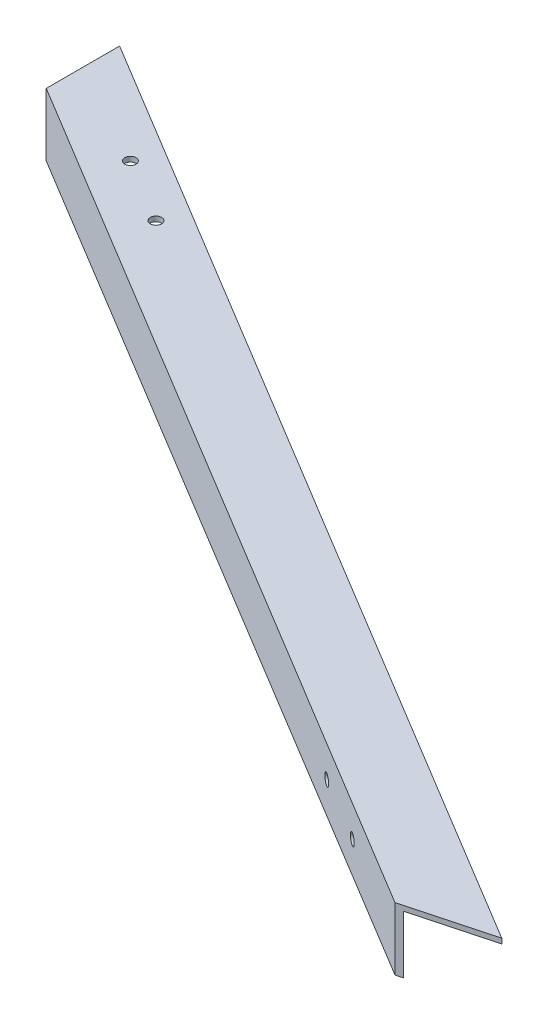
ISO-10303-21;
HEADER;
FILE_DESCRIPTION(('STEP AP214'),'2;1');
FILE_NAME('part.step','',(''),(''),'','','');
FILE_SCHEMA(('AUTOMOTIVE_DESIGN { 1 0 10303 214 1 1 1 1 }'));
ENDSEC;
DATA;
#1=APPLICATION_CONTEXT('core data for automotive mechanical design processes');
#2=APPLICATION_PROTOCOL_DEFINITION('international standard','automotive_design',2000,#1);
#3=PRODUCT_CONTEXT('',#1,'mechanical');
#4=PRODUCT('Part','Part','',(#3));
#5=PRODUCT_RELATED_PRODUCT_CATEGORY('part','',(#4));
#6=PRODUCT_DEFINITION_FORMATION('','',#4);
#7=PRODUCT_DEFINITION_CONTEXT('part definition',#1,'design');
#8=PRODUCT_DEFINITION('design','',#6,#7);
#9=PRODUCT_DEFINITION_SHAPE('','',#8);
#10=(LENGTH_UNIT() NAMED_UNIT(*) SI_UNIT(.MILLI.,.METRE.));
#11=(NAMED_UNIT(*) PLANE_ANGLE_UNIT() SI_UNIT($,.RADIAN.));
#12=(NAMED_UNIT(*) SI_UNIT($,.STERADIAN.) SOLID_ANGLE_UNIT());
#13=UNCERTAINTY_MEASURE_WITH_UNIT(LENGTH_MEASURE(1.E-05),#10,'distance_accuracy_value','');
#14=(GEOMETRIC_REPRESENTATION_CONTEXT(3) GLOBAL_UNCERTAINTY_ASSIGNED_CONTEXT((#13)) GLOBAL_UNIT_ASSIGNED_CONTEXT((#10,
#11,#12)) REPRESENTATION_CONTEXT('',''));
#15=CARTESIAN_POINT('',(0.,0.,0.));
#16=DIRECTION('',(0.,0.,1.));
#17=DIRECTION('',(1.,0.,0.));
#18=AXIS2_PLACEMENT_3D('',#15,#16,#17);
#19=CARTESIAN_POINT('',(-1366.522079355,1741.9,2606.955776238));
#20=DIRECTION('',(0.,-1.,0.));
#21=DIRECTION('',(0.965925826288944,0.,-0.258819045102985));
#22=AXIS2_PLACEMENT_3D('',#19,#20,#21);
#23=CYLINDRICAL_SURFACE('',#22,4.5);
#24=CARTESIAN_POINT('',(-1366.522079355,1742.,2606.955776238));
#25=DIRECTION('',(0.,-1.,0.));
#26=DIRECTION('',(0.965925826288944,0.,-0.258819045102985));
#27=AXIS2_PLACEMENT_3D('',#24,#25,#26);
#28=CIRCLE('',#27,4.5);
#29=CARTESIAN_POINT('',(-1362.175413136,1742.,2605.791090535));
#30=VERTEX_POINT('',#29);
#31=EDGE_CURVE('E141',#30,#30,#28,.T.);
#32=ORIENTED_EDGE('',*,*,#31,.T.);
#33=DIRECTION('',(0.,1.,0.));
#34=VECTOR('',#33,1.);
#35=CARTESIAN_POINT('',(-1362.175413136,1741.9,2605.791090535));
#36=LINE('',#35,#34);
#37=CARTESIAN_POINT('',(-1362.175413136,1746.,2605.791090535));
#38=VERTEX_POINT('',#37);
#39=EDGE_CURVE('E11',#30,#38,#36,.T.);
#40=ORIENTED_EDGE('',*,*,#39,.T.);
#41=CARTESIAN_POINT('',(-1366.522079355,1746.,2606.955776238));
#42=DIRECTION('',(0.,-1.,0.));
#43=DIRECTION('',(0.965925826288944,0.,-0.258819045102985));
#44=AXIS2_PLACEMENT_3D('',#41,#42,#43);
#45=CIRCLE('',#44,4.5);
#46=EDGE_CURVE('E161',#38,#38,#45,.T.);
#47=ORIENTED_EDGE('',*,*,#46,.F.);
#48=ORIENTED_EDGE('',*,*,#39,.F.);
#49=EDGE_LOOP('',(#32,#40,#47,#48));
#50=FACE_BOUND('',#49,.T.);
#51=ADVANCED_FACE('F17',(#50),#23,.F.);
#52=CARTESIAN_POINT('',(-1315.151526504,1741.9,2637.956845571));
#53=DIRECTION('',(0.,-1.,0.));
#54=DIRECTION('',(0.965925826288944,0.,-0.258819045102985));
#55=AXIS2_PLACEMENT_3D('',#52,#53,#54);
#56=CYLINDRICAL_SURFACE('',#55,4.5);
#57=CARTESIAN_POINT('',(-1315.151526504,1742.,2637.956845571));
#58=DIRECTION('',(0.,-1.,0.));
#59=DIRECTION('',(0.965925826288944,0.,-0.258819045102985));
#60=AXIS2_PLACEMENT_3D('',#57,#58,#59);
#61=CIRCLE('',#60,4.5);
#62=CARTESIAN_POINT('',(-1310.804860285,1742.,2636.792159868));
#63=VERTEX_POINT('',#62);
#64=EDGE_CURVE('E138',#63,#63,#61,.T.);
#65=ORIENTED_EDGE('',*,*,#64,.T.);
#66=DIRECTION('',(0.,1.,0.));
#67=VECTOR('',#66,1.);
#68=CARTESIAN_POINT('',(-1310.804860285,1741.9,2636.792159868));
#69=LINE('',#68,#67);
#70=CARTESIAN_POINT('',(-1310.804860285,1746.,2636.792159868));
#71=VERTEX_POINT('',#70);
#72=EDGE_CURVE('E26',#63,#71,#69,.T.);
#73=ORIENTED_EDGE('',*,*,#72,.T.);
#74=CARTESIAN_POINT('',(-1315.151526504,1746.,2637.956845571));
#75=DIRECTION('',(0.,-1.,0.));
#76=DIRECTION('',(0.965925826288944,0.,-0.258819045102985));
#77=AXIS2_PLACEMENT_3D('',#74,#75,#76);
#78=CIRCLE('',#77,4.5);
#79=EDGE_CURVE('E159',#71,#71,#78,.T.);
#80=ORIENTED_EDGE('',*,*,#79,.F.);
#81=ORIENTED_EDGE('',*,*,#72,.F.);
#82=EDGE_LOOP('',(#65,#73,#80,#81));
#83=FACE_BOUND('',#82,.T.);
#84=ADVANCED_FACE('F288',(#83),#56,.F.);
#85=CARTESIAN_POINT('',(-1557.75754959,1696.,2520.748721302));
#86=DIRECTION('',(0.516684488886123,0.,-0.856175880847204));
#87=DIRECTION('',(0.,-1.,0.));
#88=AXIS2_PLACEMENT_3D('',#85,#86,#87);
#89=PLANE('',#88);
#90=CARTESIAN_POINT('',(-884.9214029801,1721.,2926.791461225));
#91=DIRECTION('',(0.516684488886123,0.,-0.856175880847204));
#92=DIRECTION('',(0.856175880847204,0.,0.516684488886123));
#93=AXIS2_PLACEMENT_3D('',#90,#91,#92);
#94=CIRCLE('',#93,4.5);
#95=CARTESIAN_POINT('',(-881.0686115163,1721.,2929.116541425));
#96=VERTEX_POINT('',#95);
#97=EDGE_CURVE('E123',#96,#96,#94,.T.);
#98=ORIENTED_EDGE('',*,*,#97,.F.);
#99=EDGE_LOOP('',(#98));
#100=FACE_BOUND('',#99,.T.);
#101=CARTESIAN_POINT('',(-833.5508501292,1721.,2957.792530558));
#102=DIRECTION('',(0.516684488886123,0.,-0.856175880847204));
#103=DIRECTION('',(0.856175880847204,0.,0.516684488886123));
#104=AXIS2_PLACEMENT_3D('',#101,#102,#103);
#105=CIRCLE('',#104,4.5);
#106=CARTESIAN_POINT('',(-829.6980586654,1721.,2960.117610758));
#107=VERTEX_POINT('',#106);
#108=EDGE_CURVE('E119',#107,#107,#105,.T.);
#109=ORIENTED_EDGE('',*,*,#108,.F.);
#110=EDGE_LOOP('',(#109));
#111=FACE_BOUND('',#110,.T.);
#112=DIRECTION('',(0.,1.,0.));
#113=VECTOR('',#112,1.);
#114=CARTESIAN_POINT('',(-1450.,1708.5,2585.77818041));
#115=LINE('',#114,#113);
#116=CARTESIAN_POINT('',(-1450.,1696.,2585.77818041));
#117=VERTEX_POINT('',#116);
#118=CARTESIAN_POINT('',(-1450.,1742.,2585.77818041));
#119=VERTEX_POINT('',#118);
#120=EDGE_CURVE('E199',#117,#119,#115,.T.);
#121=ORIENTED_EDGE('',*,*,#120,.T.);
#122=DIRECTION('',(0.856175880847204,0.,0.516684488886123));
#123=VECTOR('',#122,1.);
#124=CARTESIAN_POINT('',(-1557.75754959,1742.,2520.748721302));
#125=LINE('',#124,#123);
#126=CARTESIAN_POINT('',(-744.6387605197,1742.,3011.449143181));
#127=VERTEX_POINT('',#126);
#128=EDGE_CURVE('E142',#119,#127,#125,.T.);
#129=ORIENTED_EDGE('',*,*,#128,.T.);
#130=DIRECTION('',(0.,-1.,0.));
#131=VECTOR('',#130,1.);
#132=CARTESIAN_POINT('',(-744.6387605197,848.,3011.449143181));
#133=LINE('',#132,#131);
#134=CARTESIAN_POINT('',(-744.6387605197,1696.,3011.449143181));
#135=VERTEX_POINT('',#134);
#136=EDGE_CURVE('E170',#127,#135,#133,.T.);
#137=ORIENTED_EDGE('',*,*,#136,.T.);
#138=DIRECTION('',(0.856175880847204,0.,0.516684488886123));
#139=VECTOR('',#138,1.);
#140=CARTESIAN_POINT('',(-1557.75754959,1696.,2520.748721302));
#141=LINE('',#140,#139);
#142=EDGE_CURVE('E166',#117,#135,#141,.T.);
#143=ORIENTED_EDGE('',*,*,#142,.F.);
#144=EDGE_LOOP('',(#121,#129,#137,#143));
#145=FACE_BOUND('',#144,.T.);
#146=ADVANCED_FACE('F266',(#100,#111,#145),#89,.T.);
#147=CARTESIAN_POINT('',(-1557.75754959,1742.,2520.748721302));
#148=DIRECTION('',(0.,-1.,0.));
#149=DIRECTION('',(0.,0.,-1.));
#150=AXIS2_PLACEMENT_3D('',#147,#148,#149);
#151=PLANE('',#150);
#152=ORIENTED_EDGE('',*,*,#31,.F.);
#153=EDGE_LOOP('',(#152));
#154=FACE_BOUND('',#153,.T.);
#155=ORIENTED_EDGE('',*,*,#64,.F.);
#156=EDGE_LOOP('',(#155));
#157=FACE_BOUND('',#156,.T.);
#158=DIRECTION('',(0.,0.,-1.));
#159=VECTOR('',#158,1.);
#160=CARTESIAN_POINT('',(-1450.,1742.,2555.599419487));
#161=LINE('',#160,#159);
#162=CARTESIAN_POINT('',(-1450.,1742.,2532.050901905));
#163=VERTEX_POINT('',#162);
#164=EDGE_CURVE('E194',#119,#163,#161,.T.);
#165=ORIENTED_EDGE('',*,*,#164,.T.);
#166=DIRECTION('',(0.856175880847204,0.,0.516684488886123));
#167=VECTOR('',#166,1.);
#168=CARTESIAN_POINT('',(-1533.990063101,1742.,2481.364630783));
#169=LINE('',#168,#167);
#170=CARTESIAN_POINT('',(-682.984506497,1742.,2994.928935606));
#171=VERTEX_POINT('',#170);
#172=EDGE_CURVE('E137',#163,#171,#169,.T.);
#173=ORIENTED_EDGE('',*,*,#172,.T.);
#174=DIRECTION('',(-0.965925826288944,0.,0.258819045102985));
#175=VECTOR('',#174,1.);
#176=CARTESIAN_POINT('',(-713.4712112364,1742.,3003.09782352));
#177=LINE('',#176,#175);
#178=EDGE_CURVE('E173',#171,#127,#177,.T.);
#179=ORIENTED_EDGE('',*,*,#178,.T.);
#180=ORIENTED_EDGE('',*,*,#128,.F.);
#181=EDGE_LOOP('',(#165,#173,#179,#180));
#182=FACE_BOUND('',#181,.T.);
#183=ADVANCED_FACE('F191',(#154,#157,#182),#151,.T.);
#184=CARTESIAN_POINT('',(-1533.990063101,1742.,2481.364630783));
#185=DIRECTION('',(0.516684488886123,0.,-0.856175880847204));
#186=DIRECTION('',(0.,-1.,0.));
#187=AXIS2_PLACEMENT_3D('',#184,#185,#186);
#188=PLANE('',#187);
#189=DIRECTION('',(0.856175880847204,0.,0.516684488886123));
#190=VECTOR('',#189,1.);
#191=CARTESIAN_POINT('',(-1533.990063101,1746.,2481.364630783));
#192=LINE('',#191,#190);
#193=CARTESIAN_POINT('',(-1450.,1746.,2532.050901905));
#194=VERTEX_POINT('',#193);
#195=CARTESIAN_POINT('',(-682.984506497,1746.,2994.928935606));
#196=VERTEX_POINT('',#195);
#197=EDGE_CURVE('E162',#194,#196,#192,.T.);
#198=ORIENTED_EDGE('',*,*,#197,.T.);
#199=DIRECTION('',(0.,-1.,0.));
#200=VECTOR('',#199,1.);
#201=CARTESIAN_POINT('',(-682.984506497,871.,2994.928935606));
#202=LINE('',#201,#200);
#203=EDGE_CURVE('E132',#196,#171,#202,.T.);
#204=ORIENTED_EDGE('',*,*,#203,.T.);
#205=ORIENTED_EDGE('',*,*,#172,.F.);
#206=DIRECTION('',(0.,1.,0.));
#207=VECTOR('',#206,1.);
#208=CARTESIAN_POINT('',(-1450.,1731.5,2532.050901905));
#209=LINE('',#208,#207);
#210=EDGE_CURVE('E200',#163,#194,#209,.T.);
#211=ORIENTED_EDGE('',*,*,#210,.T.);
#212=EDGE_LOOP('',(#198,#204,#205,#211));
#213=FACE_BOUND('',#212,.T.);
#214=ADVANCED_FACE('F19',(#213),#188,.T.);
#215=CARTESIAN_POINT('',(-884.8697345312,1721.,2926.705843637));
#216=DIRECTION('',(0.516684488886123,0.,-0.856175880847204));
#217=DIRECTION('',(0.856175880847204,0.,0.516684488886123));
#218=AXIS2_PLACEMENT_3D('',#215,#216,#217);
#219=CYLINDRICAL_SURFACE('',#218,4.5);
#220=ORIENTED_EDGE('',*,*,#97,.T.);
#221=DIRECTION('',(-0.516684488886123,0.,0.856175880847204));
#222=VECTOR('',#221,1.);
#223=CARTESIAN_POINT('',(-881.0169430674,1721.,2929.030923837));
#224=LINE('',#223,#222);
#225=CARTESIAN_POINT('',(-883.1353494715,1721.,2932.541244948));
#226=VERTEX_POINT('',#225);
#227=EDGE_CURVE('E130',#96,#226,#224,.T.);
#228=ORIENTED_EDGE('',*,*,#227,.T.);
#229=CARTESIAN_POINT('',(-886.9881409353,1721.,2930.216164748));
#230=DIRECTION('',(0.516684488886123,0.,-0.856175880847204));
#231=DIRECTION('',(0.856175880847204,0.,0.516684488886123));
#232=AXIS2_PLACEMENT_3D('',#229,#230,#231);
#233=CIRCLE('',#232,4.5);
#234=EDGE_CURVE('E212',#226,#226,#233,.T.);
#235=ORIENTED_EDGE('',*,*,#234,.F.);
#236=ORIENTED_EDGE('',*,*,#227,.F.);
#237=EDGE_LOOP('',(#220,#228,#235,#236));
#238=FACE_BOUND('',#237,.T.);
#239=ADVANCED_FACE('F274',(#238),#219,.F.);
#240=CARTESIAN_POINT('',(-833.4991816804,1721.,2957.70691297));
#241=DIRECTION('',(0.516684488886123,0.,-0.856175880847204));
#242=DIRECTION('',(0.856175880847204,0.,0.516684488886123));
#243=AXIS2_PLACEMENT_3D('',#240,#241,#242);
#244=CYLINDRICAL_SURFACE('',#243,4.5);
#245=ORIENTED_EDGE('',*,*,#108,.T.);
#246=DIRECTION('',(-0.516684488886123,0.,0.856175880847204));
#247=VECTOR('',#246,1.);
#248=CARTESIAN_POINT('',(-829.6463902165,1721.,2960.03199317));
#249=LINE('',#248,#247);
#250=CARTESIAN_POINT('',(-831.7647966207,1721.,2963.542314281));
#251=VERTEX_POINT('',#250);
#252=EDGE_CURVE('E116',#107,#251,#249,.T.);
#253=ORIENTED_EDGE('',*,*,#252,.T.);
#254=CARTESIAN_POINT('',(-835.6175880845,1721.,2961.217234081));
#255=DIRECTION('',(0.516684488886123,0.,-0.856175880847204));
#256=DIRECTION('',(0.856175880847204,0.,0.516684488886123));
#257=AXIS2_PLACEMENT_3D('',#254,#255,#256);
#258=CIRCLE('',#257,4.5);
#259=EDGE_CURVE('E121',#251,#251,#258,.T.);
#260=ORIENTED_EDGE('',*,*,#259,.F.);
#261=ORIENTED_EDGE('',*,*,#252,.F.);
#262=EDGE_LOOP('',(#245,#253,#260,#261));
#263=FACE_BOUND('',#262,.T.);
#264=ADVANCED_FACE('F117',(#263),#244,.F.);
#265=CARTESIAN_POINT('',(-46.32860907335,0.,2824.337502034));
#266=DIRECTION('',(-0.258819045102985,0.,-0.965925826288944));
#267=DIRECTION('',(-0.965925826288944,0.,0.258819045102985));
#268=AXIS2_PLACEMENT_3D('',#265,#266,#267);
#269=PLANE('',#268);
#270=DIRECTION('',(0.,1.,0.));
#271=VECTOR('',#270,1.);
#272=CARTESIAN_POINT('',(-750.,873.,3012.88568297));
#273=LINE('',#272,#271);
#274=CARTESIAN_POINT('',(-750.,1696.,3012.88568297));
#275=VERTEX_POINT('',#274);
#276=CARTESIAN_POINT('',(-750.,1746.,3012.88568297));
#277=VERTEX_POINT('',#276);
#278=EDGE_CURVE('E235',#275,#277,#273,.T.);
#279=ORIENTED_EDGE('',*,*,#278,.F.);
#280=DIRECTION('',(-0.965925826288944,0.,0.258819045102985));
#281=VECTOR('',#280,1.);
#282=CARTESIAN_POINT('',(-714.8634455588,1696.,3003.470871583));
#283=LINE('',#282,#281);
#284=EDGE_CURVE('E167',#135,#275,#283,.T.);
#285=ORIENTED_EDGE('',*,*,#284,.F.);
#286=ORIENTED_EDGE('',*,*,#136,.F.);
#287=ORIENTED_EDGE('',*,*,#178,.F.);
#288=ORIENTED_EDGE('',*,*,#203,.F.);
#289=DIRECTION('',(0.965925826288944,0.,-0.258819045102985));
#290=VECTOR('',#289,1.);
#291=CARTESIAN_POINT('',(-697.4605165285,1746.,2998.807770803));
#292=LINE('',#291,#290);
#293=EDGE_CURVE('E157',#277,#196,#292,.T.);
#294=ORIENTED_EDGE('',*,*,#293,.F.);
#295=EDGE_LOOP('',(#279,#285,#286,#287,#288,#294));
#296=FACE_BOUND('',#295,.T.);
#297=ADVANCED_FACE('F188',(#296),#269,.F.);
#298=CARTESIAN_POINT('',(-1559.824287545,1696.,2524.173424825));
#299=DIRECTION('',(0.,-1.,0.));
#300=DIRECTION('',(0.,0.,-1.));
#301=AXIS2_PLACEMENT_3D('',#298,#299,#300);
#302=PLANE('',#301);
#303=ORIENTED_EDGE('',*,*,#142,.T.);
#304=ORIENTED_EDGE('',*,*,#284,.T.);
#305=DIRECTION('',(0.856175880847204,0.,0.516684488886123));
#306=VECTOR('',#305,1.);
#307=CARTESIAN_POINT('',(-1559.824287545,1696.,2524.173424825));
#308=LINE('',#307,#306);
#309=CARTESIAN_POINT('',(-1450.,1696.,2590.450117672));
#310=VERTEX_POINT('',#309);
#311=EDGE_CURVE('E239',#310,#275,#308,.T.);
#312=ORIENTED_EDGE('',*,*,#311,.F.);
#313=DIRECTION('',(0.,0.,-1.));
#314=VECTOR('',#313,1.);
#315=CARTESIAN_POINT('',(-1450.,1696.,2557.311771248));
#316=LINE('',#315,#314);
#317=EDGE_CURVE('E215',#310,#117,#316,.T.);
#318=ORIENTED_EDGE('',*,*,#317,.T.);
#319=EDGE_LOOP('',(#303,#304,#312,#318));
#320=FACE_BOUND('',#319,.T.);
#321=ADVANCED_FACE('F265',(#320),#302,.T.);
#322=CARTESIAN_POINT('',(-1533.990063101,1746.,2481.364630783));
#323=DIRECTION('',(0.,1.,0.));
#324=DIRECTION('',(1.,0.,0.));
#325=AXIS2_PLACEMENT_3D('',#322,#323,#324);
#326=PLANE('',#325);
#327=ORIENTED_EDGE('',*,*,#46,.T.);
#328=EDGE_LOOP('',(#327));
#329=FACE_BOUND('',#328,.T.);
#330=ORIENTED_EDGE('',*,*,#79,.T.);
#331=EDGE_LOOP('',(#330));
#332=FACE_BOUND('',#331,.T.);
#333=DIRECTION('',(0.,0.,1.));
#334=VECTOR('',#333,1.);
#335=CARTESIAN_POINT('',(-1450.,1746.,2535.907374227));
#336=LINE('',#335,#334);
#337=CARTESIAN_POINT('',(-1450.,1746.,2590.450117672));
#338=VERTEX_POINT('',#337);
#339=EDGE_CURVE('E206',#194,#338,#336,.T.);
#340=ORIENTED_EDGE('',*,*,#339,.T.);
#341=DIRECTION('',(0.856175880847204,0.,0.516684488886123));
#342=VECTOR('',#341,1.);
#343=CARTESIAN_POINT('',(-1559.824287545,1746.,2524.173424825));
#344=LINE('',#343,#342);
#345=EDGE_CURVE('E238',#338,#277,#344,.T.);
#346=ORIENTED_EDGE('',*,*,#345,.T.);
#347=ORIENTED_EDGE('',*,*,#293,.T.);
#348=ORIENTED_EDGE('',*,*,#197,.F.);
#349=EDGE_LOOP('',(#340,#346,#347,#348));
#350=FACE_BOUND('',#349,.T.);
#351=ADVANCED_FACE('F267',(#329,#332,#350),#326,.T.);
#352=CARTESIAN_POINT('',(-1450.,1721.,2590.450117672));
#353=DIRECTION('',(1.,0.,0.));
#354=DIRECTION('',(0.,1.,0.));
#355=AXIS2_PLACEMENT_3D('',#352,#353,#354);
#356=PLANE('',#355);
#357=DIRECTION('',(0.,-1.,0.));
#358=VECTOR('',#357,1.);
#359=CARTESIAN_POINT('',(-1450.,1733.5,2590.450117672));
#360=LINE('',#359,#358);
#361=EDGE_CURVE('E256',#338,#310,#360,.T.);
#362=ORIENTED_EDGE('',*,*,#361,.F.);
#363=ORIENTED_EDGE('',*,*,#339,.F.);
#364=ORIENTED_EDGE('',*,*,#210,.F.);
#365=ORIENTED_EDGE('',*,*,#164,.F.);
#366=ORIENTED_EDGE('',*,*,#120,.F.);
#367=ORIENTED_EDGE('',*,*,#317,.F.);
#368=EDGE_LOOP('',(#362,#363,#364,#365,#366,#367));
#369=FACE_BOUND('',#368,.T.);
#370=ADVANCED_FACE('F204',(#369),#356,.F.);
#371=CARTESIAN_POINT('',(-1559.824287545,1746.,2524.173424825));
#372=DIRECTION('',(-0.516684488886123,0.,0.856175880847204));
#373=DIRECTION('',(0.,1.,0.));
#374=AXIS2_PLACEMENT_3D('',#371,#372,#373);
#375=PLANE('',#374);
#376=ORIENTED_EDGE('',*,*,#234,.T.);
#377=EDGE_LOOP('',(#376));
#378=FACE_BOUND('',#377,.T.);
#379=ORIENTED_EDGE('',*,*,#259,.T.);
#380=EDGE_LOOP('',(#379));
#381=FACE_BOUND('',#380,.T.);
#382=ORIENTED_EDGE('',*,*,#361,.T.);
#383=ORIENTED_EDGE('',*,*,#311,.T.);
#384=ORIENTED_EDGE('',*,*,#278,.T.);
#385=ORIENTED_EDGE('',*,*,#345,.F.);
#386=EDGE_LOOP('',(#382,#383,#384,#385));
#387=FACE_BOUND('',#386,.T.);
#388=ADVANCED_FACE('F248',(#378,#381,#387),#375,.T.);
#389=CLOSED_SHELL('',(#51,#84,#146,#183,#214,#239,#264,#297,#321,#351,#370,#388));
#390=MANIFOLD_SOLID_BREP('B1',#389);
#391=ADVANCED_BREP_SHAPE_REPRESENTATION('',(#18,#390),#14);
#392=SHAPE_DEFINITION_REPRESENTATION(#9,#391);
ENDSEC;
END-ISO-10303-21;
